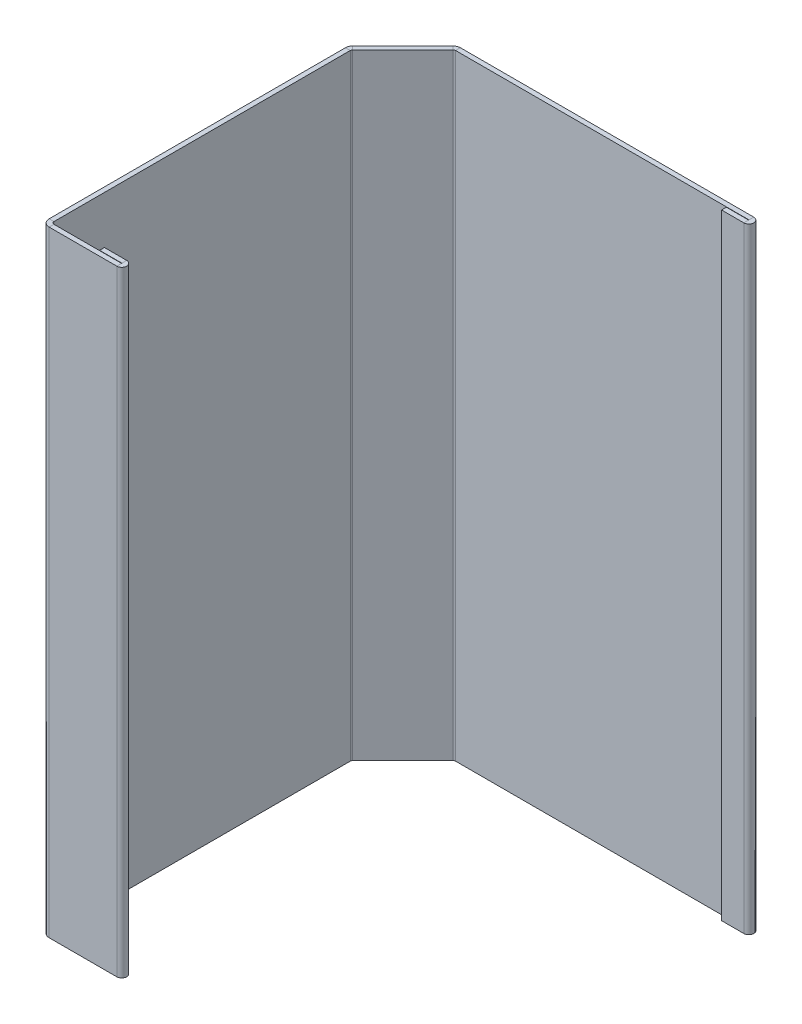
ISO-10303-21;
HEADER;
FILE_DESCRIPTION(('STEP AP214'),'2;1');
FILE_NAME('part.step','',(''),(''),'','','');
FILE_SCHEMA(('AUTOMOTIVE_DESIGN { 1 0 10303 214 1 1 1 1 }'));
ENDSEC;
DATA;
#1=APPLICATION_CONTEXT('core data for automotive mechanical design processes');
#2=APPLICATION_PROTOCOL_DEFINITION('international standard','automotive_design',2000,#1);
#3=PRODUCT_CONTEXT('',#1,'mechanical');
#4=PRODUCT('Part','Part','',(#3));
#5=PRODUCT_RELATED_PRODUCT_CATEGORY('part','',(#4));
#6=PRODUCT_DEFINITION_FORMATION('','',#4);
#7=PRODUCT_DEFINITION_CONTEXT('part definition',#1,'design');
#8=PRODUCT_DEFINITION('design','',#6,#7);
#9=PRODUCT_DEFINITION_SHAPE('','',#8);
#10=(LENGTH_UNIT() NAMED_UNIT(*) SI_UNIT(.MILLI.,.METRE.));
#11=(NAMED_UNIT(*) PLANE_ANGLE_UNIT() SI_UNIT($,.RADIAN.));
#12=(NAMED_UNIT(*) SI_UNIT($,.STERADIAN.) SOLID_ANGLE_UNIT());
#13=UNCERTAINTY_MEASURE_WITH_UNIT(LENGTH_MEASURE(1.E-05),#10,'distance_accuracy_value','');
#14=(GEOMETRIC_REPRESENTATION_CONTEXT(3) GLOBAL_UNCERTAINTY_ASSIGNED_CONTEXT((#13)) GLOBAL_UNIT_ASSIGNED_CONTEXT((#10,
#11,#12)) REPRESENTATION_CONTEXT('',''));
#15=CARTESIAN_POINT('',(0.,0.,0.));
#16=DIRECTION('',(0.,0.,1.));
#17=DIRECTION('',(1.,0.,0.));
#18=AXIS2_PLACEMENT_3D('',#15,#16,#17);
#19=CARTESIAN_POINT('',(-93.5944248014184,96.,1.715745144978));
#20=DIRECTION('',(0.,1.,0.));
#21=DIRECTION('',(0.,0.,1.));
#22=AXIS2_PLACEMENT_3D('',#19,#20,#21);
#23=PLANE('',#22);
#24=DIRECTION('',(-1.,0.,0.));
#25=VECTOR('',#24,1.);
#26=CARTESIAN_POINT('',(0.,96.,1.5));
#27=LINE('',#26,#25);
#28=CARTESIAN_POINT('',(-1.55,96.,1.5));
#29=VERTEX_POINT('',#28);
#30=CARTESIAN_POINT('',(-93.0735699463963,96.,1.5));
#31=VERTEX_POINT('',#30);
#32=EDGE_CURVE('E356',#29,#31,#27,.T.);
#33=ORIENTED_EDGE('',*,*,#32,.F.);
#34=DIRECTION('',(0.,0.,-1.));
#35=VECTOR('',#34,1.);
#36=CARTESIAN_POINT('',(-1.55,96.,1.5));
#37=LINE('',#36,#35);
#38=CARTESIAN_POINT('',(-1.55,96.,0.));
#39=VERTEX_POINT('',#38);
#40=EDGE_CURVE('E233',#29,#39,#37,.T.);
#41=ORIENTED_EDGE('',*,*,#40,.T.);
#42=DIRECTION('',(-1.,0.,0.));
#43=VECTOR('',#42,1.);
#44=CARTESIAN_POINT('',(0.,96.,0.));
#45=LINE('',#44,#43);
#46=CARTESIAN_POINT('',(-93.0735699463963,96.,0.));
#47=VERTEX_POINT('',#46);
#48=EDGE_CURVE('E217',#39,#47,#45,.T.);
#49=ORIENTED_EDGE('',*,*,#48,.T.);
#50=DIRECTION('',(0.,0.,1.));
#51=VECTOR('',#50,1.);
#52=CARTESIAN_POINT('',(-93.0735699463963,96.,0.));
#53=LINE('',#52,#51);
#54=EDGE_CURVE('E11',#47,#31,#53,.T.);
#55=ORIENTED_EDGE('',*,*,#54,.T.);
#56=EDGE_LOOP('',(#33,#41,#49,#55));
#57=FACE_BOUND('',#56,.T.);
#58=ADVANCED_FACE('F41',(#57),#23,.T.);
#59=CARTESIAN_POINT('',(-109.5,-96.,110.3634));
#60=DIRECTION('',(0.,-1.,0.));
#61=DIRECTION('',(0.,0.,-1.));
#62=AXIS2_PLACEMENT_3D('',#59,#60,#61);
#63=PLANE('',#62);
#64=DIRECTION('',(-1.,0.,0.));
#65=VECTOR('',#64,1.);
#66=CARTESIAN_POINT('',(-111.,-96.,111.1));
#67=LINE('',#66,#65);
#68=CARTESIAN_POINT('',(-108.7634,-96.,111.1));
#69=VERTEX_POINT('',#68);
#70=CARTESIAN_POINT('',(-87.6683431952663,-96.,111.1));
#71=VERTEX_POINT('',#70);
#72=EDGE_CURVE('E376',#69,#71,#67,.F.);
#73=ORIENTED_EDGE('',*,*,#72,.T.);
#74=DIRECTION('',(0.,0.,1.));
#75=VECTOR('',#74,1.);
#76=CARTESIAN_POINT('',(-87.6683431952663,-96.,111.1));
#77=LINE('',#76,#75);
#78=CARTESIAN_POINT('',(-87.6683431952663,-96.,112.6));
#79=VERTEX_POINT('',#78);
#80=EDGE_CURVE('E64',#71,#79,#77,.T.);
#81=ORIENTED_EDGE('',*,*,#80,.T.);
#82=DIRECTION('',(1.,0.,0.));
#83=VECTOR('',#82,1.);
#84=CARTESIAN_POINT('',(-111.,-96.,112.6));
#85=LINE('',#84,#83);
#86=CARTESIAN_POINT('',(-108.7634,-96.,112.6));
#87=VERTEX_POINT('',#86);
#88=EDGE_CURVE('E332',#87,#79,#85,.T.);
#89=ORIENTED_EDGE('',*,*,#88,.F.);
#90=DIRECTION('',(0.,0.,-1.));
#91=VECTOR('',#90,1.);
#92=CARTESIAN_POINT('',(-108.7634,-96.,112.6));
#93=LINE('',#92,#91);
#94=EDGE_CURVE('E443',#87,#69,#93,.T.);
#95=ORIENTED_EDGE('',*,*,#94,.T.);
#96=EDGE_LOOP('',(#73,#81,#89,#95));
#97=FACE_BOUND('',#96,.T.);
#98=ADVANCED_FACE('F533',(#97),#63,.T.);
#99=CARTESIAN_POINT('',(-93.0735699463963,96.,0.));
#100=DIRECTION('',(0.,1.,0.));
#101=DIRECTION('',(0.,0.,1.));
#102=AXIS2_PLACEMENT_3D('',#99,#100,#101);
#103=PLANE('',#102);
#104=ORIENTED_EDGE('',*,*,#54,.F.);
#105=CARTESIAN_POINT('',(-93.0735699463963,96.,2.2366));
#106=DIRECTION('',(0.,-1.,0.));
#107=DIRECTION('',(0.,0.,-1.));
#108=AXIS2_PLACEMENT_3D('',#105,#106,#107);
#109=CIRCLE('',#108,2.2366);
#110=CARTESIAN_POINT('',(-94.6550849731982,96.,0.655084973198178));
#111=VERTEX_POINT('',#110);
#112=EDGE_CURVE('E359',#47,#111,#109,.F.);
#113=ORIENTED_EDGE('',*,*,#112,.T.);
#114=DIRECTION('',(-0.707106781186547,0.,-0.707106781186548));
#115=VECTOR('',#114,1.);
#116=CARTESIAN_POINT('',(-93.5944248014184,96.,1.715745144978));
#117=LINE('',#116,#115);
#118=CARTESIAN_POINT('',(-93.5944248014184,96.,1.715745144978));
#119=VERTEX_POINT('',#118);
#120=EDGE_CURVE('E49',#119,#111,#117,.T.);
#121=ORIENTED_EDGE('',*,*,#120,.F.);
#122=CARTESIAN_POINT('',(-93.0735699463963,96.,2.2366));
#123=DIRECTION('',(0.,1.,0.));
#124=DIRECTION('',(-1.,0.,0.));
#125=AXIS2_PLACEMENT_3D('',#122,#123,#124);
#126=CIRCLE('',#125,0.7366);
#127=EDGE_CURVE('E353',#31,#119,#126,.T.);
#128=ORIENTED_EDGE('',*,*,#127,.F.);
#129=EDGE_LOOP('',(#104,#113,#121,#128));
#130=FACE_BOUND('',#129,.T.);
#131=ADVANCED_FACE('F43',(#130),#103,.T.);
#132=CARTESIAN_POINT('',(-94.6550849731982,-96.,0.655084973198178));
#133=DIRECTION('',(0.,-1.,0.));
#134=DIRECTION('',(0.,0.,-1.));
#135=AXIS2_PLACEMENT_3D('',#132,#133,#134);
#136=PLANE('',#135);
#137=DIRECTION('',(0.707106781186547,0.,0.707106781186548));
#138=VECTOR('',#137,1.);
#139=CARTESIAN_POINT('',(-94.6550849731982,-96.,0.655084973198178));
#140=LINE('',#139,#138);
#141=CARTESIAN_POINT('',(-94.6550849731982,-96.,0.655084973198178));
#142=VERTEX_POINT('',#141);
#143=CARTESIAN_POINT('',(-93.5944248014184,-96.,1.715745144978));
#144=VERTEX_POINT('',#143);
#145=EDGE_CURVE('E458',#142,#144,#140,.T.);
#146=ORIENTED_EDGE('',*,*,#145,.F.);
#147=CARTESIAN_POINT('',(-93.0735699463963,-96.,2.2366));
#148=DIRECTION('',(0.,-1.,0.));
#149=DIRECTION('',(0.,0.,-1.));
#150=AXIS2_PLACEMENT_3D('',#147,#148,#149);
#151=CIRCLE('',#150,2.2366);
#152=CARTESIAN_POINT('',(-93.0735699463963,-96.,0.));
#153=VERTEX_POINT('',#152);
#154=EDGE_CURVE('E210',#153,#142,#151,.F.);
#155=ORIENTED_EDGE('',*,*,#154,.F.);
#156=DIRECTION('',(0.,0.,-1.));
#157=VECTOR('',#156,1.);
#158=CARTESIAN_POINT('',(-93.0735699463963,-96.,1.5));
#159=LINE('',#158,#157);
#160=CARTESIAN_POINT('',(-93.0735699463963,-96.,1.5));
#161=VERTEX_POINT('',#160);
#162=EDGE_CURVE('E206',#161,#153,#159,.T.);
#163=ORIENTED_EDGE('',*,*,#162,.F.);
#164=CARTESIAN_POINT('',(-93.0735699463963,-96.,2.2366));
#165=DIRECTION('',(0.,1.,0.));
#166=DIRECTION('',(-1.,0.,0.));
#167=AXIS2_PLACEMENT_3D('',#164,#165,#166);
#168=CIRCLE('',#167,0.7366);
#169=EDGE_CURVE('E390',#161,#144,#168,.T.);
#170=ORIENTED_EDGE('',*,*,#169,.T.);
#171=EDGE_LOOP('',(#146,#155,#163,#170));
#172=FACE_BOUND('',#171,.T.);
#173=ADVANCED_FACE('F540',(#172),#136,.T.);
#174=CARTESIAN_POINT('',(-93.0735699463963,-96.,1.5));
#175=DIRECTION('',(0.,-1.,0.));
#176=DIRECTION('',(0.,0.,-1.));
#177=AXIS2_PLACEMENT_3D('',#174,#175,#176);
#178=PLANE('',#177);
#179=DIRECTION('',(-0.707106781186546,0.,0.707106781186549));
#180=VECTOR('',#179,1.);
#181=CARTESIAN_POINT('',(-94.,-96.,0.));
#182=LINE('',#181,#180);
#183=CARTESIAN_POINT('',(-110.344915026802,-96.,16.3449150268019));
#184=VERTEX_POINT('',#183);
#185=EDGE_CURVE('E396',#142,#184,#182,.T.);
#186=ORIENTED_EDGE('',*,*,#185,.F.);
#187=ORIENTED_EDGE('',*,*,#145,.T.);
#188=DIRECTION('',(-0.707106781186546,0.,0.707106781186549));
#189=VECTOR('',#188,1.);
#190=CARTESIAN_POINT('',(-92.9393398282202,-96.,1.06066017177982));
#191=LINE('',#190,#189);
#192=CARTESIAN_POINT('',(-109.284254855022,-96.,17.4055751985817));
#193=VERTEX_POINT('',#192);
#194=EDGE_CURVE('E387',#144,#193,#191,.T.);
#195=ORIENTED_EDGE('',*,*,#194,.T.);
#196=DIRECTION('',(-0.707106781186547,0.,-0.707106781186547));
#197=VECTOR('',#196,1.);
#198=CARTESIAN_POINT('',(-109.284254855022,-96.,17.4055751985817));
#199=LINE('',#198,#197);
#200=EDGE_CURVE('E449',#193,#184,#199,.T.);
#201=ORIENTED_EDGE('',*,*,#200,.T.);
#202=EDGE_LOOP('',(#186,#187,#195,#201));
#203=FACE_BOUND('',#202,.T.);
#204=ADVANCED_FACE('F543',(#203),#178,.T.);
#205=CARTESIAN_POINT('',(-110.344915026802,96.,16.3449150268019));
#206=DIRECTION('',(0.,1.,0.));
#207=DIRECTION('',(0.,0.,1.));
#208=AXIS2_PLACEMENT_3D('',#205,#206,#207);
#209=PLANE('',#208);
#210=DIRECTION('',(0.707106781186547,0.,0.707106781186547));
#211=VECTOR('',#210,1.);
#212=CARTESIAN_POINT('',(-110.344915026802,96.,16.3449150268019));
#213=LINE('',#212,#211);
#214=CARTESIAN_POINT('',(-110.344915026802,96.,16.3449150268019));
#215=VERTEX_POINT('',#214);
#216=CARTESIAN_POINT('',(-109.284254855022,96.,17.4055751985817));
#217=VERTEX_POINT('',#216);
#218=EDGE_CURVE('E455',#215,#217,#213,.T.);
#219=ORIENTED_EDGE('',*,*,#218,.F.);
#220=CARTESIAN_POINT('',(-108.7634,96.,17.9264300536037));
#221=DIRECTION('',(0.,-1.,0.));
#222=DIRECTION('',(0.,0.,-1.));
#223=AXIS2_PLACEMENT_3D('',#220,#221,#222);
#224=CIRCLE('',#223,2.2366);
#225=CARTESIAN_POINT('',(-111.,96.,17.9264300536037));
#226=VERTEX_POINT('',#225);
#227=EDGE_CURVE('E365',#215,#226,#224,.F.);
#228=ORIENTED_EDGE('',*,*,#227,.T.);
#229=DIRECTION('',(-1.,0.,0.));
#230=VECTOR('',#229,1.);
#231=CARTESIAN_POINT('',(-109.5,96.,17.9264300536037));
#232=LINE('',#231,#230);
#233=CARTESIAN_POINT('',(-109.5,96.,17.9264300536037));
#234=VERTEX_POINT('',#233);
#235=EDGE_CURVE('E453',#234,#226,#232,.T.);
#236=ORIENTED_EDGE('',*,*,#235,.F.);
#237=CARTESIAN_POINT('',(-108.7634,96.,17.9264300536037));
#238=DIRECTION('',(0.,1.,0.));
#239=DIRECTION('',(-1.,0.,0.));
#240=AXIS2_PLACEMENT_3D('',#237,#238,#239);
#241=CIRCLE('',#240,0.7366);
#242=EDGE_CURVE('E347',#217,#234,#241,.T.);
#243=ORIENTED_EDGE('',*,*,#242,.F.);
#244=EDGE_LOOP('',(#219,#228,#236,#243));
#245=FACE_BOUND('',#244,.T.);
#246=ADVANCED_FACE('F483',(#245),#209,.T.);
#247=CARTESIAN_POINT('',(-109.5,96.,17.9264300536037));
#248=DIRECTION('',(0.,1.,0.));
#249=DIRECTION('',(0.,0.,1.));
#250=AXIS2_PLACEMENT_3D('',#247,#248,#249);
#251=PLANE('',#250);
#252=DIRECTION('',(-0.707106781186546,0.,0.707106781186549));
#253=VECTOR('',#252,1.);
#254=CARTESIAN_POINT('',(-94.,96.,0.));
#255=LINE('',#254,#253);
#256=EDGE_CURVE('E362',#111,#215,#255,.T.);
#257=ORIENTED_EDGE('',*,*,#256,.T.);
#258=ORIENTED_EDGE('',*,*,#218,.T.);
#259=DIRECTION('',(-0.707106781186546,0.,0.707106781186549));
#260=VECTOR('',#259,1.);
#261=CARTESIAN_POINT('',(-92.9393398282202,96.,1.06066017177982));
#262=LINE('',#261,#260);
#263=EDGE_CURVE('E350',#119,#217,#262,.T.);
#264=ORIENTED_EDGE('',*,*,#263,.F.);
#265=ORIENTED_EDGE('',*,*,#120,.T.);
#266=EDGE_LOOP('',(#257,#258,#264,#265));
#267=FACE_BOUND('',#266,.T.);
#268=ADVANCED_FACE('F461',(#267),#251,.T.);
#269=CARTESIAN_POINT('',(-111.,-96.,17.9264300536037));
#270=DIRECTION('',(0.,-1.,0.));
#271=DIRECTION('',(0.,0.,-1.));
#272=AXIS2_PLACEMENT_3D('',#269,#270,#271);
#273=PLANE('',#272);
#274=DIRECTION('',(1.,0.,0.));
#275=VECTOR('',#274,1.);
#276=CARTESIAN_POINT('',(-111.,-96.,17.9264300536037));
#277=LINE('',#276,#275);
#278=CARTESIAN_POINT('',(-111.,-96.,17.9264300536037));
#279=VERTEX_POINT('',#278);
#280=CARTESIAN_POINT('',(-109.5,-96.,17.9264300536037));
#281=VERTEX_POINT('',#280);
#282=EDGE_CURVE('E451',#279,#281,#277,.T.);
#283=ORIENTED_EDGE('',*,*,#282,.F.);
#284=CARTESIAN_POINT('',(-108.7634,-96.,17.9264300536037));
#285=DIRECTION('',(0.,-1.,0.));
#286=DIRECTION('',(0.,0.,-1.));
#287=AXIS2_PLACEMENT_3D('',#284,#285,#286);
#288=CIRCLE('',#287,2.2366);
#289=EDGE_CURVE('E399',#184,#279,#288,.F.);
#290=ORIENTED_EDGE('',*,*,#289,.F.);
#291=ORIENTED_EDGE('',*,*,#200,.F.);
#292=CARTESIAN_POINT('',(-108.7634,-96.,17.9264300536037));
#293=DIRECTION('',(0.,1.,0.));
#294=DIRECTION('',(-1.,0.,0.));
#295=AXIS2_PLACEMENT_3D('',#292,#293,#294);
#296=CIRCLE('',#295,0.7366);
#297=EDGE_CURVE('E384',#193,#281,#296,.T.);
#298=ORIENTED_EDGE('',*,*,#297,.T.);
#299=EDGE_LOOP('',(#283,#290,#291,#298));
#300=FACE_BOUND('',#299,.T.);
#301=ADVANCED_FACE('F552',(#300),#273,.T.);
#302=CARTESIAN_POINT('',(-109.284254855022,-96.,17.4055751985817));
#303=DIRECTION('',(0.,-1.,0.));
#304=DIRECTION('',(0.,0.,-1.));
#305=AXIS2_PLACEMENT_3D('',#302,#303,#304);
#306=PLANE('',#305);
#307=DIRECTION('',(0.,0.,1.));
#308=VECTOR('',#307,1.);
#309=CARTESIAN_POINT('',(-111.,-96.,17.0000000000001));
#310=LINE('',#309,#308);
#311=CARTESIAN_POINT('',(-111.,-96.,110.3634));
#312=VERTEX_POINT('',#311);
#313=EDGE_CURVE('E402',#279,#312,#310,.T.);
#314=ORIENTED_EDGE('',*,*,#313,.F.);
#315=ORIENTED_EDGE('',*,*,#282,.T.);
#316=DIRECTION('',(0.,0.,1.));
#317=VECTOR('',#316,1.);
#318=CARTESIAN_POINT('',(-109.5,-96.,17.0000000000001));
#319=LINE('',#318,#317);
#320=CARTESIAN_POINT('',(-109.5,-96.,110.3634));
#321=VERTEX_POINT('',#320);
#322=EDGE_CURVE('E381',#281,#321,#319,.T.);
#323=ORIENTED_EDGE('',*,*,#322,.T.);
#324=DIRECTION('',(-1.,0.,0.));
#325=VECTOR('',#324,1.);
#326=CARTESIAN_POINT('',(-109.5,-96.,110.3634));
#327=LINE('',#326,#325);
#328=EDGE_CURVE('E441',#321,#312,#327,.T.);
#329=ORIENTED_EDGE('',*,*,#328,.T.);
#330=EDGE_LOOP('',(#314,#315,#323,#329));
#331=FACE_BOUND('',#330,.T.);
#332=ADVANCED_FACE('F555',(#331),#306,.T.);
#333=CARTESIAN_POINT('',(-111.,96.,110.3634));
#334=DIRECTION('',(0.,1.,0.));
#335=DIRECTION('',(0.,0.,1.));
#336=AXIS2_PLACEMENT_3D('',#333,#334,#335);
#337=PLANE('',#336);
#338=DIRECTION('',(1.,0.,0.));
#339=VECTOR('',#338,1.);
#340=CARTESIAN_POINT('',(-111.,96.,110.3634));
#341=LINE('',#340,#339);
#342=CARTESIAN_POINT('',(-111.,96.,110.3634));
#343=VERTEX_POINT('',#342);
#344=CARTESIAN_POINT('',(-109.5,96.,110.3634));
#345=VERTEX_POINT('',#344);
#346=EDGE_CURVE('E447',#343,#345,#341,.T.);
#347=ORIENTED_EDGE('',*,*,#346,.F.);
#348=CARTESIAN_POINT('',(-108.7634,96.,110.3634));
#349=DIRECTION('',(0.,-1.,0.));
#350=DIRECTION('',(0.,0.,-1.));
#351=AXIS2_PLACEMENT_3D('',#348,#349,#350);
#352=CIRCLE('',#351,2.2366);
#353=CARTESIAN_POINT('',(-108.7634,96.,112.6));
#354=VERTEX_POINT('',#353);
#355=EDGE_CURVE('E371',#343,#354,#352,.F.);
#356=ORIENTED_EDGE('',*,*,#355,.T.);
#357=DIRECTION('',(0.,0.,1.));
#358=VECTOR('',#357,1.);
#359=CARTESIAN_POINT('',(-108.7634,96.,111.1));
#360=LINE('',#359,#358);
#361=CARTESIAN_POINT('',(-108.7634,96.,111.1));
#362=VERTEX_POINT('',#361);
#363=EDGE_CURVE('E445',#362,#354,#360,.T.);
#364=ORIENTED_EDGE('',*,*,#363,.F.);
#365=CARTESIAN_POINT('',(-108.7634,96.,110.3634));
#366=DIRECTION('',(0.,1.,0.));
#367=DIRECTION('',(-1.,0.,0.));
#368=AXIS2_PLACEMENT_3D('',#365,#366,#367);
#369=CIRCLE('',#368,0.7366);
#370=EDGE_CURVE('E341',#345,#362,#369,.T.);
#371=ORIENTED_EDGE('',*,*,#370,.F.);
#372=EDGE_LOOP('',(#347,#356,#364,#371));
#373=FACE_BOUND('',#372,.T.);
#374=ADVANCED_FACE('F559',(#373),#337,.T.);
#375=CARTESIAN_POINT('',(-108.7634,96.,111.1));
#376=DIRECTION('',(0.,1.,0.));
#377=DIRECTION('',(0.,0.,1.));
#378=AXIS2_PLACEMENT_3D('',#375,#376,#377);
#379=PLANE('',#378);
#380=DIRECTION('',(0.,0.,1.));
#381=VECTOR('',#380,1.);
#382=CARTESIAN_POINT('',(-111.,96.,17.0000000000001));
#383=LINE('',#382,#381);
#384=EDGE_CURVE('E368',#226,#343,#383,.T.);
#385=ORIENTED_EDGE('',*,*,#384,.T.);
#386=ORIENTED_EDGE('',*,*,#346,.T.);
#387=DIRECTION('',(0.,0.,1.));
#388=VECTOR('',#387,1.);
#389=CARTESIAN_POINT('',(-109.5,96.,17.0000000000001));
#390=LINE('',#389,#388);
#391=EDGE_CURVE('E344',#234,#345,#390,.T.);
#392=ORIENTED_EDGE('',*,*,#391,.F.);
#393=ORIENTED_EDGE('',*,*,#235,.T.);
#394=EDGE_LOOP('',(#385,#386,#392,#393));
#395=FACE_BOUND('',#394,.T.);
#396=ADVANCED_FACE('F563',(#395),#379,.T.);
#397=CARTESIAN_POINT('',(-108.7634,-96.,112.6));
#398=DIRECTION('',(0.,-1.,0.));
#399=DIRECTION('',(0.,0.,-1.));
#400=AXIS2_PLACEMENT_3D('',#397,#398,#399);
#401=PLANE('',#400);
#402=ORIENTED_EDGE('',*,*,#94,.F.);
#403=CARTESIAN_POINT('',(-108.7634,-96.,110.3634));
#404=DIRECTION('',(0.,-1.,0.));
#405=DIRECTION('',(0.,0.,-1.));
#406=AXIS2_PLACEMENT_3D('',#403,#404,#405);
#407=CIRCLE('',#406,2.2366);
#408=EDGE_CURVE('E338',#312,#87,#407,.F.);
#409=ORIENTED_EDGE('',*,*,#408,.F.);
#410=ORIENTED_EDGE('',*,*,#328,.F.);
#411=CARTESIAN_POINT('',(-108.7634,-96.,110.3634));
#412=DIRECTION('',(0.,1.,0.));
#413=DIRECTION('',(-1.,0.,0.));
#414=AXIS2_PLACEMENT_3D('',#411,#412,#413);
#415=CIRCLE('',#414,0.7366);
#416=EDGE_CURVE('E378',#321,#69,#415,.T.);
#417=ORIENTED_EDGE('',*,*,#416,.T.);
#418=EDGE_LOOP('',(#402,#409,#410,#417));
#419=FACE_BOUND('',#418,.T.);
#420=ADVANCED_FACE('F567',(#419),#401,.T.);
#421=CARTESIAN_POINT('',(-111.,96.,112.6));
#422=DIRECTION('',(0.,0.,-1.));
#423=DIRECTION('',(-1.,0.,0.));
#424=AXIS2_PLACEMENT_3D('',#421,#422,#423);
#425=PLANE('',#424);
#426=ORIENTED_EDGE('',*,*,#88,.T.);
#427=DIRECTION('',(0.,-1.,0.));
#428=VECTOR('',#427,1.);
#429=CARTESIAN_POINT('',(-87.6683431952663,-96.,112.6));
#430=LINE('',#429,#428);
#431=CARTESIAN_POINT('',(-87.6683431952663,96.,112.6));
#432=VERTEX_POINT('',#431);
#433=EDGE_CURVE('E280',#79,#432,#430,.F.);
#434=ORIENTED_EDGE('',*,*,#433,.T.);
#435=DIRECTION('',(1.,0.,0.));
#436=VECTOR('',#435,1.);
#437=CARTESIAN_POINT('',(-111.,96.,112.6));
#438=LINE('',#437,#436);
#439=EDGE_CURVE('E334',#354,#432,#438,.T.);
#440=ORIENTED_EDGE('',*,*,#439,.F.);
#441=DIRECTION('',(0.,-1.,0.));
#442=VECTOR('',#441,1.);
#443=CARTESIAN_POINT('',(-108.7634,96.,112.6));
#444=LINE('',#443,#442);
#445=EDGE_CURVE('E374',#354,#87,#444,.T.);
#446=ORIENTED_EDGE('',*,*,#445,.T.);
#447=EDGE_LOOP('',(#426,#434,#440,#446));
#448=FACE_BOUND('',#447,.T.);
#449=ADVANCED_FACE('F570',(#448),#425,.F.);
#450=CARTESIAN_POINT('',(-111.,96.,111.1));
#451=DIRECTION('',(0.,0.,-1.));
#452=DIRECTION('',(-1.,0.,0.));
#453=AXIS2_PLACEMENT_3D('',#450,#451,#452);
#454=PLANE('',#453);
#455=DIRECTION('',(0.,-1.,0.));
#456=VECTOR('',#455,1.);
#457=CARTESIAN_POINT('',(-87.6683431952663,-96.,111.1));
#458=LINE('',#457,#456);
#459=CARTESIAN_POINT('',(-87.6683431952663,96.,111.1));
#460=VERTEX_POINT('',#459);
#461=EDGE_CURVE('E291',#71,#460,#458,.F.);
#462=ORIENTED_EDGE('',*,*,#461,.F.);
#463=ORIENTED_EDGE('',*,*,#72,.F.);
#464=DIRECTION('',(0.,-1.,0.));
#465=VECTOR('',#464,1.);
#466=CARTESIAN_POINT('',(-108.7634,96.,111.1));
#467=LINE('',#466,#465);
#468=EDGE_CURVE('E438',#362,#69,#467,.T.);
#469=ORIENTED_EDGE('',*,*,#468,.F.);
#470=DIRECTION('',(-1.,0.,0.));
#471=VECTOR('',#470,1.);
#472=CARTESIAN_POINT('',(-111.,96.,111.1));
#473=LINE('',#472,#471);
#474=EDGE_CURVE('E337',#362,#460,#473,.F.);
#475=ORIENTED_EDGE('',*,*,#474,.T.);
#476=EDGE_LOOP('',(#462,#463,#469,#475));
#477=FACE_BOUND('',#476,.T.);
#478=ADVANCED_FACE('F575',(#477),#454,.T.);
#479=CARTESIAN_POINT('',(-108.7634,96.,110.3634));
#480=DIRECTION('',(0.,-1.,0.));
#481=DIRECTION('',(0.,0.,-1.));
#482=AXIS2_PLACEMENT_3D('',#479,#480,#481);
#483=CYLINDRICAL_SURFACE('',#482,0.7366);
#484=ORIENTED_EDGE('',*,*,#416,.F.);
#485=DIRECTION('',(0.,-1.,0.));
#486=VECTOR('',#485,1.);
#487=CARTESIAN_POINT('',(-109.5,96.,110.3634));
#488=LINE('',#487,#486);
#489=EDGE_CURVE('E435',#345,#321,#488,.T.);
#490=ORIENTED_EDGE('',*,*,#489,.F.);
#491=ORIENTED_EDGE('',*,*,#370,.T.);
#492=ORIENTED_EDGE('',*,*,#468,.T.);
#493=EDGE_LOOP('',(#484,#490,#491,#492));
#494=FACE_BOUND('',#493,.T.);
#495=ADVANCED_FACE('F579',(#494),#483,.F.);
#496=CARTESIAN_POINT('',(-109.5,96.,17.0000000000001));
#497=DIRECTION('',(1.,0.,0.));
#498=DIRECTION('',(0.,0.,-1.));
#499=AXIS2_PLACEMENT_3D('',#496,#497,#498);
#500=PLANE('',#499);
#501=ORIENTED_EDGE('',*,*,#322,.F.);
#502=DIRECTION('',(0.,-1.,0.));
#503=VECTOR('',#502,1.);
#504=CARTESIAN_POINT('',(-109.5,96.,17.9264300536037));
#505=LINE('',#504,#503);
#506=EDGE_CURVE('E432',#234,#281,#505,.T.);
#507=ORIENTED_EDGE('',*,*,#506,.F.);
#508=ORIENTED_EDGE('',*,*,#391,.T.);
#509=ORIENTED_EDGE('',*,*,#489,.T.);
#510=EDGE_LOOP('',(#501,#507,#508,#509));
#511=FACE_BOUND('',#510,.T.);
#512=ADVANCED_FACE('F583',(#511),#500,.T.);
#513=CARTESIAN_POINT('',(-108.7634,96.,17.9264300536037));
#514=DIRECTION('',(0.,-1.,0.));
#515=DIRECTION('',(0.,0.,-1.));
#516=AXIS2_PLACEMENT_3D('',#513,#514,#515);
#517=CYLINDRICAL_SURFACE('',#516,0.7366);
#518=ORIENTED_EDGE('',*,*,#297,.F.);
#519=DIRECTION('',(0.,-1.,0.));
#520=VECTOR('',#519,1.);
#521=CARTESIAN_POINT('',(-109.284254855022,96.,17.4055751985817));
#522=LINE('',#521,#520);
#523=EDGE_CURVE('E429',#217,#193,#522,.T.);
#524=ORIENTED_EDGE('',*,*,#523,.F.);
#525=ORIENTED_EDGE('',*,*,#242,.T.);
#526=ORIENTED_EDGE('',*,*,#506,.T.);
#527=EDGE_LOOP('',(#518,#524,#525,#526));
#528=FACE_BOUND('',#527,.T.);
#529=ADVANCED_FACE('F489',(#528),#517,.F.);
#530=CARTESIAN_POINT('',(-92.9393398282202,96.,1.06066017177982));
#531=DIRECTION('',(0.707106781186549,0.,0.707106781186546));
#532=DIRECTION('',(0.707106781186546,0.,-0.707106781186549));
#533=AXIS2_PLACEMENT_3D('',#530,#531,#532);
#534=PLANE('',#533);
#535=ORIENTED_EDGE('',*,*,#194,.F.);
#536=DIRECTION('',(0.,-1.,0.));
#537=VECTOR('',#536,1.);
#538=CARTESIAN_POINT('',(-93.5944248014184,96.,1.715745144978));
#539=LINE('',#538,#537);
#540=EDGE_CURVE('E426',#119,#144,#539,.T.);
#541=ORIENTED_EDGE('',*,*,#540,.F.);
#542=ORIENTED_EDGE('',*,*,#263,.T.);
#543=ORIENTED_EDGE('',*,*,#523,.T.);
#544=EDGE_LOOP('',(#535,#541,#542,#543));
#545=FACE_BOUND('',#544,.T.);
#546=ADVANCED_FACE('F492',(#545),#534,.T.);
#547=CARTESIAN_POINT('',(-93.0735699463963,96.,2.2366));
#548=DIRECTION('',(0.,-1.,0.));
#549=DIRECTION('',(0.,0.,-1.));
#550=AXIS2_PLACEMENT_3D('',#547,#548,#549);
#551=CYLINDRICAL_SURFACE('',#550,0.7366);
#552=ORIENTED_EDGE('',*,*,#169,.F.);
#553=DIRECTION('',(0.,-1.,0.));
#554=VECTOR('',#553,1.);
#555=CARTESIAN_POINT('',(-93.0735699463963,96.,1.5));
#556=LINE('',#555,#554);
#557=EDGE_CURVE('E423',#31,#161,#556,.T.);
#558=ORIENTED_EDGE('',*,*,#557,.F.);
#559=ORIENTED_EDGE('',*,*,#127,.T.);
#560=ORIENTED_EDGE('',*,*,#540,.T.);
#561=EDGE_LOOP('',(#552,#558,#559,#560));
#562=FACE_BOUND('',#561,.T.);
#563=ADVANCED_FACE('F495',(#562),#551,.F.);
#564=CARTESIAN_POINT('',(0.,96.,1.5));
#565=DIRECTION('',(0.,0.,1.));
#566=DIRECTION('',(1.,0.,0.));
#567=AXIS2_PLACEMENT_3D('',#564,#565,#566);
#568=PLANE('',#567);
#569=DIRECTION('',(0.,1.,0.));
#570=VECTOR('',#569,1.);
#571=CARTESIAN_POINT('',(-1.55,96.,1.5));
#572=LINE('',#571,#570);
#573=CARTESIAN_POINT('',(-1.55,-96.,1.5));
#574=VERTEX_POINT('',#573);
#575=EDGE_CURVE('E243',#29,#574,#572,.F.);
#576=ORIENTED_EDGE('',*,*,#575,.F.);
#577=ORIENTED_EDGE('',*,*,#32,.T.);
#578=ORIENTED_EDGE('',*,*,#557,.T.);
#579=DIRECTION('',(-1.,0.,0.));
#580=VECTOR('',#579,1.);
#581=CARTESIAN_POINT('',(0.,-96.,1.5));
#582=LINE('',#581,#580);
#583=EDGE_CURVE('E211',#574,#161,#582,.T.);
#584=ORIENTED_EDGE('',*,*,#583,.F.);
#585=EDGE_LOOP('',(#576,#577,#578,#584));
#586=FACE_BOUND('',#585,.T.);
#587=ADVANCED_FACE('F498',(#586),#568,.T.);
#588=CARTESIAN_POINT('',(0.,96.,0.));
#589=DIRECTION('',(0.,0.,1.));
#590=DIRECTION('',(1.,0.,0.));
#591=AXIS2_PLACEMENT_3D('',#588,#589,#590);
#592=PLANE('',#591);
#593=ORIENTED_EDGE('',*,*,#48,.F.);
#594=DIRECTION('',(0.,1.,0.));
#595=VECTOR('',#594,1.);
#596=CARTESIAN_POINT('',(-1.54999999999999,96.,0.));
#597=LINE('',#596,#595);
#598=CARTESIAN_POINT('',(-1.54999999999999,-96.,0.));
#599=VERTEX_POINT('',#598);
#600=EDGE_CURVE('E215',#39,#599,#597,.F.);
#601=ORIENTED_EDGE('',*,*,#600,.T.);
#602=DIRECTION('',(-1.,0.,0.));
#603=VECTOR('',#602,1.);
#604=CARTESIAN_POINT('',(0.,-96.,0.));
#605=LINE('',#604,#603);
#606=EDGE_CURVE('E202',#599,#153,#605,.T.);
#607=ORIENTED_EDGE('',*,*,#606,.T.);
#608=DIRECTION('',(0.,-1.,0.));
#609=VECTOR('',#608,1.);
#610=CARTESIAN_POINT('',(-93.0735699463963,96.,0.));
#611=LINE('',#610,#609);
#612=EDGE_CURVE('E421',#47,#153,#611,.T.);
#613=ORIENTED_EDGE('',*,*,#612,.F.);
#614=EDGE_LOOP('',(#593,#601,#607,#613));
#615=FACE_BOUND('',#614,.T.);
#616=ADVANCED_FACE('F216',(#615),#592,.F.);
#617=CARTESIAN_POINT('',(-93.0735699463963,96.,2.2366));
#618=DIRECTION('',(0.,-1.,0.));
#619=DIRECTION('',(0.,0.,-1.));
#620=AXIS2_PLACEMENT_3D('',#617,#618,#619);
#621=CYLINDRICAL_SURFACE('',#620,2.2366);
#622=ORIENTED_EDGE('',*,*,#154,.T.);
#623=DIRECTION('',(0.,-1.,0.));
#624=VECTOR('',#623,1.);
#625=CARTESIAN_POINT('',(-94.6550849731982,96.,0.655084973198178));
#626=LINE('',#625,#624);
#627=EDGE_CURVE('E418',#111,#142,#626,.T.);
#628=ORIENTED_EDGE('',*,*,#627,.F.);
#629=ORIENTED_EDGE('',*,*,#112,.F.);
#630=ORIENTED_EDGE('',*,*,#612,.T.);
#631=EDGE_LOOP('',(#622,#628,#629,#630));
#632=FACE_BOUND('',#631,.T.);
#633=ADVANCED_FACE('F471',(#632),#621,.T.);
#634=CARTESIAN_POINT('',(-94.,96.,0.));
#635=DIRECTION('',(0.707106781186549,0.,0.707106781186546));
#636=DIRECTION('',(0.707106781186546,0.,-0.707106781186549));
#637=AXIS2_PLACEMENT_3D('',#634,#635,#636);
#638=PLANE('',#637);
#639=ORIENTED_EDGE('',*,*,#185,.T.);
#640=DIRECTION('',(0.,-1.,0.));
#641=VECTOR('',#640,1.);
#642=CARTESIAN_POINT('',(-110.344915026802,96.,16.3449150268019));
#643=LINE('',#642,#641);
#644=EDGE_CURVE('E415',#215,#184,#643,.T.);
#645=ORIENTED_EDGE('',*,*,#644,.F.);
#646=ORIENTED_EDGE('',*,*,#256,.F.);
#647=ORIENTED_EDGE('',*,*,#627,.T.);
#648=EDGE_LOOP('',(#639,#645,#646,#647));
#649=FACE_BOUND('',#648,.T.);
#650=ADVANCED_FACE('F475',(#649),#638,.F.);
#651=CARTESIAN_POINT('',(-108.7634,96.,17.9264300536037));
#652=DIRECTION('',(0.,-1.,0.));
#653=DIRECTION('',(0.,0.,-1.));
#654=AXIS2_PLACEMENT_3D('',#651,#652,#653);
#655=CYLINDRICAL_SURFACE('',#654,2.2366);
#656=ORIENTED_EDGE('',*,*,#289,.T.);
#657=DIRECTION('',(0.,-1.,0.));
#658=VECTOR('',#657,1.);
#659=CARTESIAN_POINT('',(-111.,96.,17.9264300536037));
#660=LINE('',#659,#658);
#661=EDGE_CURVE('E412',#226,#279,#660,.T.);
#662=ORIENTED_EDGE('',*,*,#661,.F.);
#663=ORIENTED_EDGE('',*,*,#227,.F.);
#664=ORIENTED_EDGE('',*,*,#644,.T.);
#665=EDGE_LOOP('',(#656,#662,#663,#664));
#666=FACE_BOUND('',#665,.T.);
#667=ADVANCED_FACE('F480',(#666),#655,.T.);
#668=CARTESIAN_POINT('',(-111.,96.,17.0000000000001));
#669=DIRECTION('',(1.,0.,0.));
#670=DIRECTION('',(0.,0.,-1.));
#671=AXIS2_PLACEMENT_3D('',#668,#669,#670);
#672=PLANE('',#671);
#673=ORIENTED_EDGE('',*,*,#313,.T.);
#674=DIRECTION('',(0.,-1.,0.));
#675=VECTOR('',#674,1.);
#676=CARTESIAN_POINT('',(-111.,96.,110.3634));
#677=LINE('',#676,#675);
#678=EDGE_CURVE('E409',#343,#312,#677,.T.);
#679=ORIENTED_EDGE('',*,*,#678,.F.);
#680=ORIENTED_EDGE('',*,*,#384,.F.);
#681=ORIENTED_EDGE('',*,*,#661,.T.);
#682=EDGE_LOOP('',(#673,#679,#680,#681));
#683=FACE_BOUND('',#682,.T.);
#684=ADVANCED_FACE('F604',(#683),#672,.F.);
#685=CARTESIAN_POINT('',(-108.7634,96.,110.3634));
#686=DIRECTION('',(0.,-1.,0.));
#687=DIRECTION('',(0.,0.,-1.));
#688=AXIS2_PLACEMENT_3D('',#685,#686,#687);
#689=CYLINDRICAL_SURFACE('',#688,2.2366);
#690=ORIENTED_EDGE('',*,*,#408,.T.);
#691=ORIENTED_EDGE('',*,*,#445,.F.);
#692=ORIENTED_EDGE('',*,*,#355,.F.);
#693=ORIENTED_EDGE('',*,*,#678,.T.);
#694=EDGE_LOOP('',(#690,#691,#692,#693));
#695=FACE_BOUND('',#694,.T.);
#696=ADVANCED_FACE('F607',(#695),#689,.T.);
#697=CARTESIAN_POINT('',(-108.7634,96.,110.3634));
#698=DIRECTION('',(0.,1.,0.));
#699=DIRECTION('',(-1.,0.,0.));
#700=AXIS2_PLACEMENT_3D('',#697,#698,#699);
#701=PLANE('',#700);
#702=DIRECTION('',(0.,0.,1.));
#703=VECTOR('',#702,1.);
#704=CARTESIAN_POINT('',(-87.6683431952663,96.,111.1));
#705=LINE('',#704,#703);
#706=EDGE_CURVE('E296',#460,#432,#705,.T.);
#707=ORIENTED_EDGE('',*,*,#706,.F.);
#708=ORIENTED_EDGE('',*,*,#474,.F.);
#709=ORIENTED_EDGE('',*,*,#363,.T.);
#710=ORIENTED_EDGE('',*,*,#439,.T.);
#711=EDGE_LOOP('',(#707,#708,#709,#710));
#712=FACE_BOUND('',#711,.T.);
#713=ADVANCED_FACE('F610',(#712),#701,.T.);
#714=CARTESIAN_POINT('',(-108.7634,-96.,110.3634));
#715=DIRECTION('',(0.,1.,0.));
#716=DIRECTION('',(-1.,0.,0.));
#717=AXIS2_PLACEMENT_3D('',#714,#715,#716);
#718=PLANE('',#717);
#719=ORIENTED_EDGE('',*,*,#606,.F.);
#720=DIRECTION('',(0.,0.,-1.));
#721=VECTOR('',#720,1.);
#722=CARTESIAN_POINT('',(-1.55,-96.,1.5));
#723=LINE('',#722,#721);
#724=EDGE_CURVE('E56',#574,#599,#723,.T.);
#725=ORIENTED_EDGE('',*,*,#724,.F.);
#726=ORIENTED_EDGE('',*,*,#583,.T.);
#727=ORIENTED_EDGE('',*,*,#162,.T.);
#728=EDGE_LOOP('',(#719,#725,#726,#727));
#729=FACE_BOUND('',#728,.T.);
#730=ADVANCED_FACE('F204',(#729),#718,.F.);
#731=CARTESIAN_POINT('',(-91.1433431952663,-96.,109.5));
#732=DIRECTION('',(0.,1.,0.));
#733=DIRECTION('',(1.,0.,0.));
#734=AXIS2_PLACEMENT_3D('',#731,#732,#733);
#735=PLANE('',#734);
#736=DIRECTION('',(0.,0.,-1.));
#737=VECTOR('',#736,1.);
#738=CARTESIAN_POINT('',(-87.6683431952663,-96.,109.5));
#739=LINE('',#738,#737);
#740=CARTESIAN_POINT('',(-87.6683431952663,-96.,111.));
#741=VERTEX_POINT('',#740);
#742=CARTESIAN_POINT('',(-87.6683431952663,-96.,109.5));
#743=VERTEX_POINT('',#742);
#744=EDGE_CURVE('E326',#741,#743,#739,.T.);
#745=ORIENTED_EDGE('',*,*,#744,.F.);
#746=DIRECTION('',(-1.,0.,0.));
#747=VECTOR('',#746,1.);
#748=CARTESIAN_POINT('',(-91.1433431952663,-96.,111.));
#749=LINE('',#748,#747);
#750=CARTESIAN_POINT('',(-94.6183431952663,-96.,111.));
#751=VERTEX_POINT('',#750);
#752=EDGE_CURVE('E317',#751,#741,#749,.F.);
#753=ORIENTED_EDGE('',*,*,#752,.F.);
#754=DIRECTION('',(0.,0.,-1.));
#755=VECTOR('',#754,1.);
#756=CARTESIAN_POINT('',(-94.6183431952663,-96.,109.5));
#757=LINE('',#756,#755);
#758=CARTESIAN_POINT('',(-94.6183431952663,-96.,109.5));
#759=VERTEX_POINT('',#758);
#760=EDGE_CURVE('E324',#751,#759,#757,.T.);
#761=ORIENTED_EDGE('',*,*,#760,.T.);
#762=DIRECTION('',(1.,0.,0.));
#763=VECTOR('',#762,1.);
#764=CARTESIAN_POINT('',(-91.1433431952663,-96.,109.5));
#765=LINE('',#764,#763);
#766=EDGE_CURVE('E305',#759,#743,#765,.T.);
#767=ORIENTED_EDGE('',*,*,#766,.T.);
#768=EDGE_LOOP('',(#745,#753,#761,#767));
#769=FACE_BOUND('',#768,.T.);
#770=ADVANCED_FACE('F614',(#769),#735,.F.);
#771=CARTESIAN_POINT('',(-94.6183431952663,0.,109.5));
#772=DIRECTION('',(1.,0.,0.));
#773=DIRECTION('',(0.,-1.,0.));
#774=AXIS2_PLACEMENT_3D('',#771,#772,#773);
#775=PLANE('',#774);
#776=ORIENTED_EDGE('',*,*,#760,.F.);
#777=DIRECTION('',(0.,1.,0.));
#778=VECTOR('',#777,1.);
#779=CARTESIAN_POINT('',(-94.6183431952663,0.,111.));
#780=LINE('',#779,#778);
#781=CARTESIAN_POINT('',(-94.6183431952663,96.,111.));
#782=VERTEX_POINT('',#781);
#783=EDGE_CURVE('E314',#782,#751,#780,.F.);
#784=ORIENTED_EDGE('',*,*,#783,.F.);
#785=DIRECTION('',(0.,0.,-1.));
#786=VECTOR('',#785,1.);
#787=CARTESIAN_POINT('',(-94.6183431952663,96.,109.5));
#788=LINE('',#787,#786);
#789=CARTESIAN_POINT('',(-94.6183431952663,96.,109.5));
#790=VERTEX_POINT('',#789);
#791=EDGE_CURVE('E304',#782,#790,#788,.T.);
#792=ORIENTED_EDGE('',*,*,#791,.T.);
#793=DIRECTION('',(0.,-1.,0.));
#794=VECTOR('',#793,1.);
#795=CARTESIAN_POINT('',(-94.6183431952663,0.,109.5));
#796=LINE('',#795,#794);
#797=EDGE_CURVE('E301',#790,#759,#796,.T.);
#798=ORIENTED_EDGE('',*,*,#797,.T.);
#799=EDGE_LOOP('',(#776,#784,#792,#798));
#800=FACE_BOUND('',#799,.T.);
#801=ADVANCED_FACE('F622',(#800),#775,.F.);
#802=CARTESIAN_POINT('',(-91.1433431952663,96.,109.5));
#803=DIRECTION('',(0.,-1.,0.));
#804=DIRECTION('',(-1.,0.,0.));
#805=AXIS2_PLACEMENT_3D('',#802,#803,#804);
#806=PLANE('',#805);
#807=DIRECTION('',(-1.,0.,0.));
#808=VECTOR('',#807,1.);
#809=CARTESIAN_POINT('',(-91.1433431952663,96.,111.));
#810=LINE('',#809,#808);
#811=CARTESIAN_POINT('',(-87.6683431952663,96.,111.));
#812=VERTEX_POINT('',#811);
#813=EDGE_CURVE('E299',#812,#782,#810,.T.);
#814=ORIENTED_EDGE('',*,*,#813,.F.);
#815=DIRECTION('',(0.,0.,-1.));
#816=VECTOR('',#815,1.);
#817=CARTESIAN_POINT('',(-87.6683431952663,96.,109.5));
#818=LINE('',#817,#816);
#819=CARTESIAN_POINT('',(-87.6683431952663,96.,109.5));
#820=VERTEX_POINT('',#819);
#821=EDGE_CURVE('E329',#812,#820,#818,.T.);
#822=ORIENTED_EDGE('',*,*,#821,.T.);
#823=DIRECTION('',(-1.,0.,0.));
#824=VECTOR('',#823,1.);
#825=CARTESIAN_POINT('',(-91.1433431952663,96.,109.5));
#826=LINE('',#825,#824);
#827=EDGE_CURVE('E311',#820,#790,#826,.T.);
#828=ORIENTED_EDGE('',*,*,#827,.T.);
#829=ORIENTED_EDGE('',*,*,#791,.F.);
#830=EDGE_LOOP('',(#814,#822,#828,#829));
#831=FACE_BOUND('',#830,.T.);
#832=ADVANCED_FACE('F618',(#831),#806,.F.);
#833=CARTESIAN_POINT('',(-91.1433431952663,0.,109.5));
#834=DIRECTION('',(0.,0.,-1.));
#835=DIRECTION('',(-1.,0.,0.));
#836=AXIS2_PLACEMENT_3D('',#833,#834,#835);
#837=PLANE('',#836);
#838=ORIENTED_EDGE('',*,*,#797,.F.);
#839=ORIENTED_EDGE('',*,*,#827,.F.);
#840=DIRECTION('',(0.,1.,0.));
#841=VECTOR('',#840,1.);
#842=CARTESIAN_POINT('',(-87.6683431952663,0.,109.5));
#843=LINE('',#842,#841);
#844=EDGE_CURVE('E308',#743,#820,#843,.T.);
#845=ORIENTED_EDGE('',*,*,#844,.F.);
#846=ORIENTED_EDGE('',*,*,#766,.F.);
#847=EDGE_LOOP('',(#838,#839,#845,#846));
#848=FACE_BOUND('',#847,.T.);
#849=ADVANCED_FACE('F621',(#848),#837,.T.);
#850=CARTESIAN_POINT('',(-91.1433431952663,0.,111.));
#851=DIRECTION('',(0.,0.,-1.));
#852=DIRECTION('',(-1.,0.,0.));
#853=AXIS2_PLACEMENT_3D('',#850,#851,#852);
#854=PLANE('',#853);
#855=ORIENTED_EDGE('',*,*,#783,.T.);
#856=ORIENTED_EDGE('',*,*,#752,.T.);
#857=DIRECTION('',(0.,1.,0.));
#858=VECTOR('',#857,1.);
#859=CARTESIAN_POINT('',(-87.6683431952663,0.,111.));
#860=LINE('',#859,#858);
#861=EDGE_CURVE('E320',#741,#812,#860,.T.);
#862=ORIENTED_EDGE('',*,*,#861,.T.);
#863=ORIENTED_EDGE('',*,*,#813,.T.);
#864=EDGE_LOOP('',(#855,#856,#862,#863));
#865=FACE_BOUND('',#864,.T.);
#866=ADVANCED_FACE('F630',(#865),#854,.F.);
#867=CARTESIAN_POINT('',(-87.6683431952663,96.,111.05));
#868=DIRECTION('',(0.,1.,0.));
#869=DIRECTION('',(0.,0.,1.));
#870=AXIS2_PLACEMENT_3D('',#867,#868,#869);
#871=PLANE('',#870);
#872=ORIENTED_EDGE('',*,*,#821,.F.);
#873=CARTESIAN_POINT('',(-87.6683431952663,96.,111.05));
#874=DIRECTION('',(0.,-1.,0.));
#875=DIRECTION('',(0.,0.,-1.));
#876=AXIS2_PLACEMENT_3D('',#873,#874,#875);
#877=CIRCLE('',#876,0.0499999999999945);
#878=EDGE_CURVE('E288',#460,#812,#877,.F.);
#879=ORIENTED_EDGE('',*,*,#878,.F.);
#880=ORIENTED_EDGE('',*,*,#706,.T.);
#881=CARTESIAN_POINT('',(-87.6683431952663,96.,111.05));
#882=DIRECTION('',(0.,-1.,0.));
#883=DIRECTION('',(0.,0.,-1.));
#884=AXIS2_PLACEMENT_3D('',#881,#882,#883);
#885=CIRCLE('',#884,1.54999999999999);
#886=EDGE_CURVE('E282',#432,#820,#885,.F.);
#887=ORIENTED_EDGE('',*,*,#886,.T.);
#888=EDGE_LOOP('',(#872,#879,#880,#887));
#889=FACE_BOUND('',#888,.T.);
#890=ADVANCED_FACE('F633',(#889),#871,.T.);
#891=CARTESIAN_POINT('',(-87.6683431952663,-96.,111.05));
#892=DIRECTION('',(0.,1.,0.));
#893=DIRECTION('',(0.,0.,1.));
#894=AXIS2_PLACEMENT_3D('',#891,#892,#893);
#895=PLANE('',#894);
#896=CARTESIAN_POINT('',(-87.6683431952663,-96.,111.05));
#897=DIRECTION('',(0.,-1.,0.));
#898=DIRECTION('',(0.,0.,-1.));
#899=AXIS2_PLACEMENT_3D('',#896,#897,#898);
#900=CIRCLE('',#899,0.0499999999999945);
#901=EDGE_CURVE('E278',#741,#71,#900,.T.);
#902=ORIENTED_EDGE('',*,*,#901,.F.);
#903=ORIENTED_EDGE('',*,*,#744,.T.);
#904=CARTESIAN_POINT('',(-87.6683431952663,-96.,111.05));
#905=DIRECTION('',(0.,-1.,0.));
#906=DIRECTION('',(0.,0.,-1.));
#907=AXIS2_PLACEMENT_3D('',#904,#905,#906);
#908=CIRCLE('',#907,1.54999999999999);
#909=EDGE_CURVE('E283',#743,#79,#908,.T.);
#910=ORIENTED_EDGE('',*,*,#909,.T.);
#911=ORIENTED_EDGE('',*,*,#80,.F.);
#912=EDGE_LOOP('',(#902,#903,#910,#911));
#913=FACE_BOUND('',#912,.T.);
#914=ADVANCED_FACE('F638',(#913),#895,.F.);
#915=CARTESIAN_POINT('',(-87.6683431952663,-96.,111.05));
#916=DIRECTION('',(0.,-1.,0.));
#917=DIRECTION('',(0.,0.,-1.));
#918=AXIS2_PLACEMENT_3D('',#915,#916,#917);
#919=CYLINDRICAL_SURFACE('',#918,1.54999999999999);
#920=ORIENTED_EDGE('',*,*,#433,.F.);
#921=ORIENTED_EDGE('',*,*,#909,.F.);
#922=ORIENTED_EDGE('',*,*,#844,.T.);
#923=ORIENTED_EDGE('',*,*,#886,.F.);
#924=EDGE_LOOP('',(#920,#921,#922,#923));
#925=FACE_BOUND('',#924,.T.);
#926=ADVANCED_FACE('F641',(#925),#919,.T.);
#927=CARTESIAN_POINT('',(-87.6683431952663,-96.,111.05));
#928=DIRECTION('',(0.,-1.,0.));
#929=DIRECTION('',(0.,0.,-1.));
#930=AXIS2_PLACEMENT_3D('',#927,#928,#929);
#931=CYLINDRICAL_SURFACE('',#930,0.0499999999999945);
#932=ORIENTED_EDGE('',*,*,#461,.T.);
#933=ORIENTED_EDGE('',*,*,#878,.T.);
#934=ORIENTED_EDGE('',*,*,#861,.F.);
#935=ORIENTED_EDGE('',*,*,#901,.T.);
#936=EDGE_LOOP('',(#932,#933,#934,#935));
#937=FACE_BOUND('',#936,.T.);
#938=ADVANCED_FACE('F646',(#937),#931,.F.);
#939=CARTESIAN_POINT('',(-5.025,96.,3.1));
#940=DIRECTION('',(0.,-1.,0.));
#941=DIRECTION('',(1.,0.,0.));
#942=AXIS2_PLACEMENT_3D('',#939,#940,#941);
#943=PLANE('',#942);
#944=DIRECTION('',(0.,0.,1.));
#945=VECTOR('',#944,1.);
#946=CARTESIAN_POINT('',(-1.55,96.,3.1));
#947=LINE('',#946,#945);
#948=CARTESIAN_POINT('',(-1.55,96.,1.6));
#949=VERTEX_POINT('',#948);
#950=CARTESIAN_POINT('',(-1.55,96.,3.1));
#951=VERTEX_POINT('',#950);
#952=EDGE_CURVE('E272',#949,#951,#947,.T.);
#953=ORIENTED_EDGE('',*,*,#952,.F.);
#954=DIRECTION('',(1.,0.,0.));
#955=VECTOR('',#954,1.);
#956=CARTESIAN_POINT('',(-5.025,96.,1.6));
#957=LINE('',#956,#955);
#958=CARTESIAN_POINT('',(-8.5,96.,1.6));
#959=VERTEX_POINT('',#958);
#960=EDGE_CURVE('E263',#959,#949,#957,.T.);
#961=ORIENTED_EDGE('',*,*,#960,.F.);
#962=DIRECTION('',(0.,0.,1.));
#963=VECTOR('',#962,1.);
#964=CARTESIAN_POINT('',(-8.5,96.,3.1));
#965=LINE('',#964,#963);
#966=CARTESIAN_POINT('',(-8.5,96.,3.1));
#967=VERTEX_POINT('',#966);
#968=EDGE_CURVE('E270',#959,#967,#965,.T.);
#969=ORIENTED_EDGE('',*,*,#968,.T.);
#970=DIRECTION('',(1.,0.,0.));
#971=VECTOR('',#970,1.);
#972=CARTESIAN_POINT('',(-5.025,96.,3.1));
#973=LINE('',#972,#971);
#974=EDGE_CURVE('E253',#967,#951,#973,.T.);
#975=ORIENTED_EDGE('',*,*,#974,.T.);
#976=EDGE_LOOP('',(#953,#961,#969,#975));
#977=FACE_BOUND('',#976,.T.);
#978=ADVANCED_FACE('F520',(#977),#943,.F.);
#979=CARTESIAN_POINT('',(-8.5,0.,3.1));
#980=DIRECTION('',(1.,0.,0.));
#981=DIRECTION('',(0.,1.,0.));
#982=AXIS2_PLACEMENT_3D('',#979,#980,#981);
#983=PLANE('',#982);
#984=ORIENTED_EDGE('',*,*,#968,.F.);
#985=DIRECTION('',(0.,1.,0.));
#986=VECTOR('',#985,1.);
#987=CARTESIAN_POINT('',(-8.5,0.,1.6));
#988=LINE('',#987,#986);
#989=CARTESIAN_POINT('',(-8.5,-96.,1.6));
#990=VERTEX_POINT('',#989);
#991=EDGE_CURVE('E260',#990,#959,#988,.T.);
#992=ORIENTED_EDGE('',*,*,#991,.F.);
#993=DIRECTION('',(0.,0.,1.));
#994=VECTOR('',#993,1.);
#995=CARTESIAN_POINT('',(-8.5,-96.,3.1));
#996=LINE('',#995,#994);
#997=CARTESIAN_POINT('',(-8.5,-96.,3.1));
#998=VERTEX_POINT('',#997);
#999=EDGE_CURVE('E252',#990,#998,#996,.T.);
#1000=ORIENTED_EDGE('',*,*,#999,.T.);
#1001=DIRECTION('',(0.,1.,0.));
#1002=VECTOR('',#1001,1.);
#1003=CARTESIAN_POINT('',(-8.5,0.,3.1));
#1004=LINE('',#1003,#1002);
#1005=EDGE_CURVE('E249',#998,#967,#1004,.T.);
#1006=ORIENTED_EDGE('',*,*,#1005,.T.);
#1007=EDGE_LOOP('',(#984,#992,#1000,#1006));
#1008=FACE_BOUND('',#1007,.T.);
#1009=ADVANCED_FACE('F517',(#1008),#983,.F.);
#1010=CARTESIAN_POINT('',(-5.025,-96.,3.1));
#1011=DIRECTION('',(0.,1.,0.));
#1012=DIRECTION('',(-1.,0.,0.));
#1013=AXIS2_PLACEMENT_3D('',#1010,#1011,#1012);
#1014=PLANE('',#1013);
#1015=DIRECTION('',(1.,0.,0.));
#1016=VECTOR('',#1015,1.);
#1017=CARTESIAN_POINT('',(-5.025,-96.,1.6));
#1018=LINE('',#1017,#1016);
#1019=CARTESIAN_POINT('',(-1.55,-96.,1.6));
#1020=VERTEX_POINT('',#1019);
#1021=EDGE_CURVE('E232',#1020,#990,#1018,.F.);
#1022=ORIENTED_EDGE('',*,*,#1021,.F.);
#1023=DIRECTION('',(0.,0.,1.));
#1024=VECTOR('',#1023,1.);
#1025=CARTESIAN_POINT('',(-1.55,-96.,3.1));
#1026=LINE('',#1025,#1024);
#1027=CARTESIAN_POINT('',(-1.55,-96.,3.1));
#1028=VERTEX_POINT('',#1027);
#1029=EDGE_CURVE('E275',#1020,#1028,#1026,.T.);
#1030=ORIENTED_EDGE('',*,*,#1029,.T.);
#1031=DIRECTION('',(-1.,0.,0.));
#1032=VECTOR('',#1031,1.);
#1033=CARTESIAN_POINT('',(-5.025,-96.,3.1));
#1034=LINE('',#1033,#1032);
#1035=EDGE_CURVE('E257',#1028,#998,#1034,.T.);
#1036=ORIENTED_EDGE('',*,*,#1035,.T.);
#1037=ORIENTED_EDGE('',*,*,#999,.F.);
#1038=EDGE_LOOP('',(#1022,#1030,#1036,#1037));
#1039=FACE_BOUND('',#1038,.T.);
#1040=ADVANCED_FACE('F514',(#1039),#1014,.F.);
#1041=CARTESIAN_POINT('',(-5.025,0.,3.1));
#1042=DIRECTION('',(0.,0.,1.));
#1043=DIRECTION('',(1.,0.,0.));
#1044=AXIS2_PLACEMENT_3D('',#1041,#1042,#1043);
#1045=PLANE('',#1044);
#1046=ORIENTED_EDGE('',*,*,#1005,.F.);
#1047=ORIENTED_EDGE('',*,*,#1035,.F.);
#1048=DIRECTION('',(0.,-1.,0.));
#1049=VECTOR('',#1048,1.);
#1050=CARTESIAN_POINT('',(-1.55,0.,3.1));
#1051=LINE('',#1050,#1049);
#1052=EDGE_CURVE('E237',#951,#1028,#1051,.T.);
#1053=ORIENTED_EDGE('',*,*,#1052,.F.);
#1054=ORIENTED_EDGE('',*,*,#974,.F.);
#1055=EDGE_LOOP('',(#1046,#1047,#1053,#1054));
#1056=FACE_BOUND('',#1055,.T.);
#1057=ADVANCED_FACE('F522',(#1056),#1045,.T.);
#1058=CARTESIAN_POINT('',(-5.025,0.,1.6));
#1059=DIRECTION('',(0.,0.,1.));
#1060=DIRECTION('',(1.,0.,0.));
#1061=AXIS2_PLACEMENT_3D('',#1058,#1059,#1060);
#1062=PLANE('',#1061);
#1063=ORIENTED_EDGE('',*,*,#991,.T.);
#1064=ORIENTED_EDGE('',*,*,#960,.T.);
#1065=DIRECTION('',(0.,1.,0.));
#1066=VECTOR('',#1065,1.);
#1067=CARTESIAN_POINT('',(-1.55,0.,1.6));
#1068=LINE('',#1067,#1066);
#1069=EDGE_CURVE('E266',#949,#1020,#1068,.F.);
#1070=ORIENTED_EDGE('',*,*,#1069,.T.);
#1071=ORIENTED_EDGE('',*,*,#1021,.T.);
#1072=EDGE_LOOP('',(#1063,#1064,#1070,#1071));
#1073=FACE_BOUND('',#1072,.T.);
#1074=ADVANCED_FACE('F510',(#1073),#1062,.F.);
#1075=CARTESIAN_POINT('',(-1.55,-96.,1.55));
#1076=DIRECTION('',(0.,-1.,0.));
#1077=DIRECTION('',(0.,0.,-1.));
#1078=AXIS2_PLACEMENT_3D('',#1075,#1076,#1077);
#1079=PLANE('',#1078);
#1080=ORIENTED_EDGE('',*,*,#1029,.F.);
#1081=CARTESIAN_POINT('',(-1.55,-96.,1.55));
#1082=DIRECTION('',(0.,1.,0.));
#1083=DIRECTION('',(0.,0.,1.));
#1084=AXIS2_PLACEMENT_3D('',#1081,#1082,#1083);
#1085=CIRCLE('',#1084,0.0500000000000001);
#1086=EDGE_CURVE('E231',#574,#1020,#1085,.F.);
#1087=ORIENTED_EDGE('',*,*,#1086,.F.);
#1088=ORIENTED_EDGE('',*,*,#724,.T.);
#1089=CARTESIAN_POINT('',(-1.55,-96.,1.55));
#1090=DIRECTION('',(0.,1.,0.));
#1091=DIRECTION('',(0.,0.,1.));
#1092=AXIS2_PLACEMENT_3D('',#1089,#1090,#1091);
#1093=CIRCLE('',#1092,1.55);
#1094=EDGE_CURVE('E222',#599,#1028,#1093,.F.);
#1095=ORIENTED_EDGE('',*,*,#1094,.T.);
#1096=EDGE_LOOP('',(#1080,#1087,#1088,#1095));
#1097=FACE_BOUND('',#1096,.T.);
#1098=ADVANCED_FACE('F229',(#1097),#1079,.T.);
#1099=CARTESIAN_POINT('',(-1.55,96.,1.55));
#1100=DIRECTION('',(0.,-1.,0.));
#1101=DIRECTION('',(0.,0.,-1.));
#1102=AXIS2_PLACEMENT_3D('',#1099,#1100,#1101);
#1103=PLANE('',#1102);
#1104=CARTESIAN_POINT('',(-1.55,96.,1.55));
#1105=DIRECTION('',(0.,1.,0.));
#1106=DIRECTION('',(0.,0.,1.));
#1107=AXIS2_PLACEMENT_3D('',#1104,#1105,#1106);
#1108=CIRCLE('',#1107,0.0500000000000001);
#1109=EDGE_CURVE('E246',#949,#29,#1108,.T.);
#1110=ORIENTED_EDGE('',*,*,#1109,.F.);
#1111=ORIENTED_EDGE('',*,*,#952,.T.);
#1112=CARTESIAN_POINT('',(-1.55,96.,1.55));
#1113=DIRECTION('',(0.,1.,0.));
#1114=DIRECTION('',(0.,0.,1.));
#1115=AXIS2_PLACEMENT_3D('',#1112,#1113,#1114);
#1116=CIRCLE('',#1115,1.55);
#1117=EDGE_CURVE('E223',#951,#39,#1116,.T.);
#1118=ORIENTED_EDGE('',*,*,#1117,.T.);
#1119=ORIENTED_EDGE('',*,*,#40,.F.);
#1120=EDGE_LOOP('',(#1110,#1111,#1118,#1119));
#1121=FACE_BOUND('',#1120,.T.);
#1122=ADVANCED_FACE('F504',(#1121),#1103,.F.);
#1123=CARTESIAN_POINT('',(-1.55,96.,1.55));
#1124=DIRECTION('',(0.,1.,0.));
#1125=DIRECTION('',(0.,0.,1.));
#1126=AXIS2_PLACEMENT_3D('',#1123,#1124,#1125);
#1127=CYLINDRICAL_SURFACE('',#1126,1.55);
#1128=ORIENTED_EDGE('',*,*,#600,.F.);
#1129=ORIENTED_EDGE('',*,*,#1117,.F.);
#1130=ORIENTED_EDGE('',*,*,#1052,.T.);
#1131=ORIENTED_EDGE('',*,*,#1094,.F.);
#1132=EDGE_LOOP('',(#1128,#1129,#1130,#1131));
#1133=FACE_BOUND('',#1132,.T.);
#1134=ADVANCED_FACE('F236',(#1133),#1127,.T.);
#1135=CARTESIAN_POINT('',(-1.55,96.,1.55));
#1136=DIRECTION('',(0.,1.,0.));
#1137=DIRECTION('',(0.,0.,1.));
#1138=AXIS2_PLACEMENT_3D('',#1135,#1136,#1137);
#1139=CYLINDRICAL_SURFACE('',#1138,0.0500000000000001);
#1140=ORIENTED_EDGE('',*,*,#575,.T.);
#1141=ORIENTED_EDGE('',*,*,#1086,.T.);
#1142=ORIENTED_EDGE('',*,*,#1069,.F.);
#1143=ORIENTED_EDGE('',*,*,#1109,.T.);
#1144=EDGE_LOOP('',(#1140,#1141,#1142,#1143));
#1145=FACE_BOUND('',#1144,.T.);
#1146=ADVANCED_FACE('F507',(#1145),#1139,.F.);
#1147=CLOSED_SHELL('',(#58,#98,#131,#173,#204,#246,#268,#301,#332,#374,#396,#420,#449,#478,#495,
#512,#529,#546,#563,#587,#616,#633,#650,#667,#684,#696,#713,#730,#770,#801,#832,#849,#866,#890,
#914,#926,#938,#978,#1009,#1040,#1057,#1074,#1098,#1122,#1134,#1146));
#1148=MANIFOLD_SOLID_BREP('B2',#1147);
#1149=ADVANCED_BREP_SHAPE_REPRESENTATION('',(#18,#1148),#14);
#1150=SHAPE_DEFINITION_REPRESENTATION(#9,#1149);
ENDSEC;
END-ISO-10303-21;
